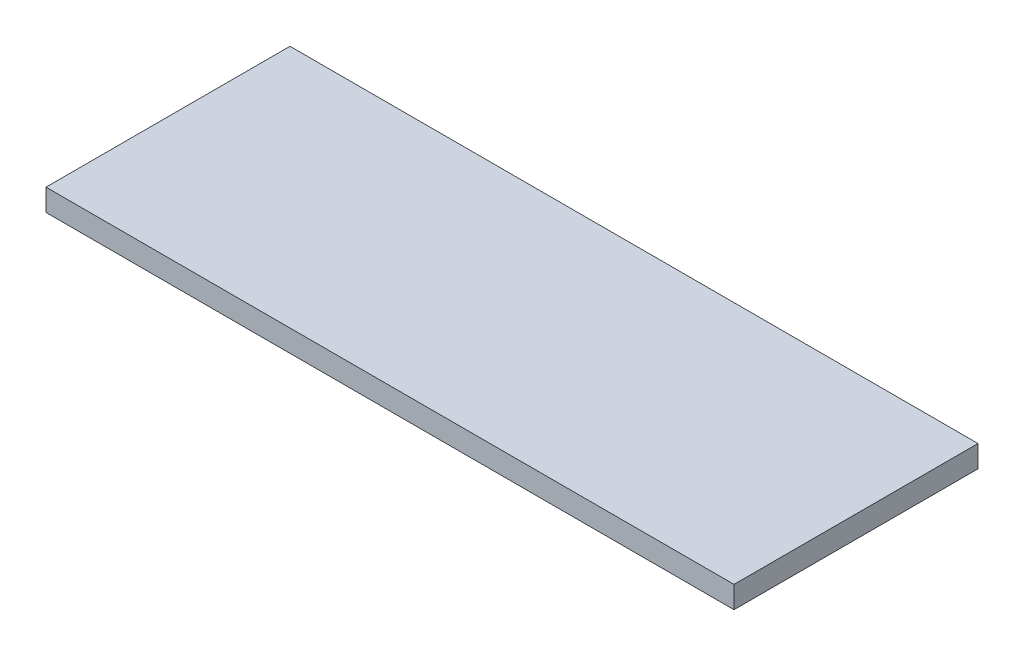
ISO-10303-21;
HEADER;
FILE_DESCRIPTION(('STEP AP214'),'2;1');
FILE_NAME('part.step','',(''),(''),'','','');
FILE_SCHEMA(('AUTOMOTIVE_DESIGN { 1 0 10303 214 1 1 1 1 }'));
ENDSEC;
DATA;
#1=APPLICATION_CONTEXT('core data for automotive mechanical design processes');
#2=APPLICATION_PROTOCOL_DEFINITION('international standard','automotive_design',2000,#1);
#3=PRODUCT_CONTEXT('',#1,'mechanical');
#4=PRODUCT('Part','Part','',(#3));
#5=PRODUCT_RELATED_PRODUCT_CATEGORY('part','',(#4));
#6=PRODUCT_DEFINITION_FORMATION('','',#4);
#7=PRODUCT_DEFINITION_CONTEXT('part definition',#1,'design');
#8=PRODUCT_DEFINITION('design','',#6,#7);
#9=PRODUCT_DEFINITION_SHAPE('','',#8);
#10=(LENGTH_UNIT() NAMED_UNIT(*) SI_UNIT(.MILLI.,.METRE.));
#11=(NAMED_UNIT(*) PLANE_ANGLE_UNIT() SI_UNIT($,.RADIAN.));
#12=(NAMED_UNIT(*) SI_UNIT($,.STERADIAN.) SOLID_ANGLE_UNIT());
#13=UNCERTAINTY_MEASURE_WITH_UNIT(LENGTH_MEASURE(1.E-05),#10,'distance_accuracy_value','');
#14=(GEOMETRIC_REPRESENTATION_CONTEXT(3) GLOBAL_UNCERTAINTY_ASSIGNED_CONTEXT((#13)) GLOBAL_UNIT_ASSIGNED_CONTEXT((#10,
#11,#12)) REPRESENTATION_CONTEXT('',''));
#15=CARTESIAN_POINT('',(0.,0.,0.));
#16=DIRECTION('',(0.,0.,1.));
#17=DIRECTION('',(1.,0.,0.));
#18=AXIS2_PLACEMENT_3D('',#15,#16,#17);
#19=CARTESIAN_POINT('',(0.,18.,0.));
#20=DIRECTION('',(-1.,0.,0.));
#21=DIRECTION('',(0.,0.,1.));
#22=AXIS2_PLACEMENT_3D('',#19,#20,#21);
#23=PLANE('',#22);
#24=DIRECTION('',(0.,0.,-1.));
#25=VECTOR('',#24,1.);
#26=CARTESIAN_POINT('',(0.,0.,0.));
#27=LINE('',#26,#25);
#28=CARTESIAN_POINT('',(0.,0.,0.));
#29=VERTEX_POINT('',#28);
#30=CARTESIAN_POINT('',(0.,0.,-200.));
#31=VERTEX_POINT('',#30);
#32=EDGE_CURVE('E95',#29,#31,#27,.T.);
#33=ORIENTED_EDGE('',*,*,#32,.T.);
#34=DIRECTION('',(0.,-1.,0.));
#35=VECTOR('',#34,1.);
#36=CARTESIAN_POINT('',(0.,18.,-200.));
#37=LINE('',#36,#35);
#38=CARTESIAN_POINT('',(0.,18.,-200.));
#39=VERTEX_POINT('',#38);
#40=EDGE_CURVE('E11',#39,#31,#37,.T.);
#41=ORIENTED_EDGE('',*,*,#40,.F.);
#42=DIRECTION('',(0.,0.,-1.));
#43=VECTOR('',#42,1.);
#44=CARTESIAN_POINT('',(0.,18.,0.));
#45=LINE('',#44,#43);
#46=CARTESIAN_POINT('',(0.,18.,0.));
#47=VERTEX_POINT('',#46);
#48=EDGE_CURVE('E83',#47,#39,#45,.T.);
#49=ORIENTED_EDGE('',*,*,#48,.F.);
#50=DIRECTION('',(0.,-1.,0.));
#51=VECTOR('',#50,1.);
#52=CARTESIAN_POINT('',(0.,18.,0.));
#53=LINE('',#52,#51);
#54=EDGE_CURVE('E91',#47,#29,#53,.T.);
#55=ORIENTED_EDGE('',*,*,#54,.T.);
#56=EDGE_LOOP('',(#33,#41,#49,#55));
#57=FACE_BOUND('',#56,.T.);
#58=ADVANCED_FACE('F32',(#57),#23,.F.);
#59=CARTESIAN_POINT('',(0.,18.,-200.));
#60=DIRECTION('',(0.,0.,1.));
#61=DIRECTION('',(1.,0.,0.));
#62=AXIS2_PLACEMENT_3D('',#59,#60,#61);
#63=PLANE('',#62);
#64=DIRECTION('',(-1.,0.,0.));
#65=VECTOR('',#64,1.);
#66=CARTESIAN_POINT('',(0.,0.,-200.));
#67=LINE('',#66,#65);
#68=CARTESIAN_POINT('',(-564.,0.,-200.));
#69=VERTEX_POINT('',#68);
#70=EDGE_CURVE('E87',#31,#69,#67,.T.);
#71=ORIENTED_EDGE('',*,*,#70,.T.);
#72=DIRECTION('',(0.,-1.,0.));
#73=VECTOR('',#72,1.);
#74=CARTESIAN_POINT('',(-564.,18.,-200.));
#75=LINE('',#74,#73);
#76=CARTESIAN_POINT('',(-564.,18.,-200.));
#77=VERTEX_POINT('',#76);
#78=EDGE_CURVE('E40',#77,#69,#75,.T.);
#79=ORIENTED_EDGE('',*,*,#78,.F.);
#80=DIRECTION('',(-1.,0.,0.));
#81=VECTOR('',#80,1.);
#82=CARTESIAN_POINT('',(0.,18.,-200.));
#83=LINE('',#82,#81);
#84=EDGE_CURVE('E78',#39,#77,#83,.T.);
#85=ORIENTED_EDGE('',*,*,#84,.F.);
#86=ORIENTED_EDGE('',*,*,#40,.T.);
#87=EDGE_LOOP('',(#71,#79,#85,#86));
#88=FACE_BOUND('',#87,.T.);
#89=ADVANCED_FACE('F86',(#88),#63,.F.);
#90=CARTESIAN_POINT('',(-564.,18.,0.));
#91=DIRECTION('',(1.,0.,0.));
#92=DIRECTION('',(0.,0.,-1.));
#93=AXIS2_PLACEMENT_3D('',#90,#91,#92);
#94=PLANE('',#93);
#95=DIRECTION('',(0.,0.,1.));
#96=VECTOR('',#95,1.);
#97=CARTESIAN_POINT('',(-564.,0.,0.));
#98=LINE('',#97,#96);
#99=CARTESIAN_POINT('',(-564.,0.,0.));
#100=VERTEX_POINT('',#99);
#101=EDGE_CURVE('E65',#69,#100,#98,.T.);
#102=ORIENTED_EDGE('',*,*,#101,.T.);
#103=DIRECTION('',(0.,-1.,0.));
#104=VECTOR('',#103,1.);
#105=CARTESIAN_POINT('',(-564.,18.,0.));
#106=LINE('',#105,#104);
#107=CARTESIAN_POINT('',(-564.,18.,0.));
#108=VERTEX_POINT('',#107);
#109=EDGE_CURVE('E88',#108,#100,#106,.T.);
#110=ORIENTED_EDGE('',*,*,#109,.F.);
#111=DIRECTION('',(0.,0.,1.));
#112=VECTOR('',#111,1.);
#113=CARTESIAN_POINT('',(-564.,18.,0.));
#114=LINE('',#113,#112);
#115=EDGE_CURVE('E81',#77,#108,#114,.T.);
#116=ORIENTED_EDGE('',*,*,#115,.F.);
#117=ORIENTED_EDGE('',*,*,#78,.T.);
#118=EDGE_LOOP('',(#102,#110,#116,#117));
#119=FACE_BOUND('',#118,.T.);
#120=ADVANCED_FACE('F89',(#119),#94,.F.);
#121=CARTESIAN_POINT('',(0.,18.,0.));
#122=DIRECTION('',(0.,0.,-1.));
#123=DIRECTION('',(-1.,0.,0.));
#124=AXIS2_PLACEMENT_3D('',#121,#122,#123);
#125=PLANE('',#124);
#126=DIRECTION('',(1.,0.,0.));
#127=VECTOR('',#126,1.);
#128=CARTESIAN_POINT('',(0.,0.,0.));
#129=LINE('',#128,#127);
#130=EDGE_CURVE('E71',#100,#29,#129,.T.);
#131=ORIENTED_EDGE('',*,*,#130,.T.);
#132=ORIENTED_EDGE('',*,*,#54,.F.);
#133=DIRECTION('',(1.,0.,0.));
#134=VECTOR('',#133,1.);
#135=CARTESIAN_POINT('',(0.,18.,0.));
#136=LINE('',#135,#134);
#137=EDGE_CURVE('E48',#108,#47,#136,.T.);
#138=ORIENTED_EDGE('',*,*,#137,.F.);
#139=ORIENTED_EDGE('',*,*,#109,.T.);
#140=EDGE_LOOP('',(#131,#132,#138,#139));
#141=FACE_BOUND('',#140,.T.);
#142=ADVANCED_FACE('F102',(#141),#125,.F.);
#143=CARTESIAN_POINT('',(0.,18.,0.));
#144=DIRECTION('',(0.,1.,0.));
#145=DIRECTION('',(0.,0.,1.));
#146=AXIS2_PLACEMENT_3D('',#143,#144,#145);
#147=PLANE('',#146);
#148=ORIENTED_EDGE('',*,*,#48,.T.);
#149=ORIENTED_EDGE('',*,*,#84,.T.);
#150=ORIENTED_EDGE('',*,*,#115,.T.);
#151=ORIENTED_EDGE('',*,*,#137,.T.);
#152=EDGE_LOOP('',(#148,#149,#150,#151));
#153=FACE_BOUND('',#152,.T.);
#154=ADVANCED_FACE('F79',(#153),#147,.T.);
#155=CARTESIAN_POINT('',(0.,0.,0.));
#156=DIRECTION('',(0.,1.,0.));
#157=DIRECTION('',(0.,0.,1.));
#158=AXIS2_PLACEMENT_3D('',#155,#156,#157);
#159=PLANE('',#158);
#160=ORIENTED_EDGE('',*,*,#32,.F.);
#161=ORIENTED_EDGE('',*,*,#130,.F.);
#162=ORIENTED_EDGE('',*,*,#101,.F.);
#163=ORIENTED_EDGE('',*,*,#70,.F.);
#164=EDGE_LOOP('',(#160,#161,#162,#163));
#165=FACE_BOUND('',#164,.T.);
#166=ADVANCED_FACE('F105',(#165),#159,.F.);
#167=CLOSED_SHELL('',(#58,#89,#120,#142,#154,#166));
#168=MANIFOLD_SOLID_BREP('B2',#167);
#169=ADVANCED_BREP_SHAPE_REPRESENTATION('',(#18,#168),#14);
#170=SHAPE_DEFINITION_REPRESENTATION(#9,#169);
ENDSEC;
END-ISO-10303-21;
